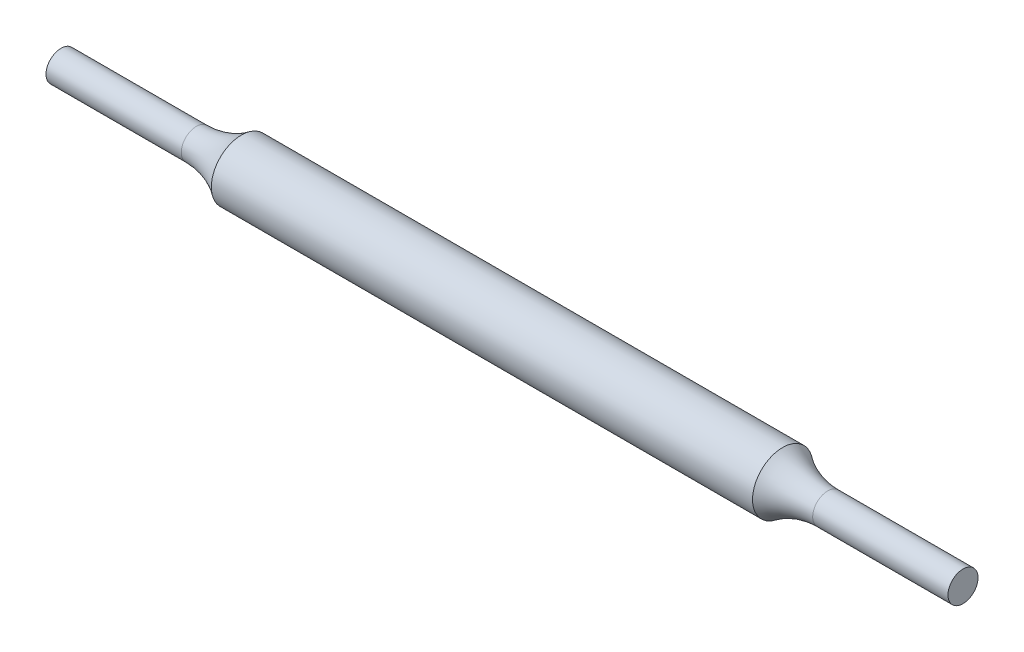
ISO-10303-21;
HEADER;
FILE_DESCRIPTION(('STEP AP214'),'2;1');
FILE_NAME('part.step','',(''),(''),'','','');
FILE_SCHEMA(('AUTOMOTIVE_DESIGN { 1 0 10303 214 1 1 1 1 }'));
ENDSEC;
DATA;
#1=APPLICATION_CONTEXT('core data for automotive mechanical design processes');
#2=APPLICATION_PROTOCOL_DEFINITION('international standard','automotive_design',2000,#1);
#3=PRODUCT_CONTEXT('',#1,'mechanical');
#4=PRODUCT('Part','Part','',(#3));
#5=PRODUCT_RELATED_PRODUCT_CATEGORY('part','',(#4));
#6=PRODUCT_DEFINITION_FORMATION('','',#4);
#7=PRODUCT_DEFINITION_CONTEXT('part definition',#1,'design');
#8=PRODUCT_DEFINITION('design','',#6,#7);
#9=PRODUCT_DEFINITION_SHAPE('','',#8);
#10=(LENGTH_UNIT() NAMED_UNIT(*) SI_UNIT(.MILLI.,.METRE.));
#11=(NAMED_UNIT(*) PLANE_ANGLE_UNIT() SI_UNIT($,.RADIAN.));
#12=(NAMED_UNIT(*) SI_UNIT($,.STERADIAN.) SOLID_ANGLE_UNIT());
#13=UNCERTAINTY_MEASURE_WITH_UNIT(LENGTH_MEASURE(1.E-05),#10,'distance_accuracy_value','');
#14=(GEOMETRIC_REPRESENTATION_CONTEXT(3) GLOBAL_UNCERTAINTY_ASSIGNED_CONTEXT((#13)) GLOBAL_UNIT_ASSIGNED_CONTEXT((#10,
#11,#12)) REPRESENTATION_CONTEXT('',''));
#15=CARTESIAN_POINT('',(0.,0.,0.));
#16=DIRECTION('',(0.,0.,1.));
#17=DIRECTION('',(1.,0.,0.));
#18=AXIS2_PLACEMENT_3D('',#15,#16,#17);
#19=CARTESIAN_POINT('',(0.,0.,0.));
#20=DIRECTION('',(1.,0.,0.));
#21=DIRECTION('',(0.,0.,-1.));
#22=AXIS2_PLACEMENT_3D('',#19,#20,#21);
#23=PLANE('',#22);
#24=CARTESIAN_POINT('',(0.,0.,0.));
#25=DIRECTION('',(-1.,0.,0.));
#26=DIRECTION('',(0.,0.,1.));
#27=AXIS2_PLACEMENT_3D('',#24,#25,#26);
#28=CIRCLE('',#27,1.);
#29=CARTESIAN_POINT('',(0.,0.,1.));
#30=VERTEX_POINT('',#29);
#31=EDGE_CURVE('E57',#30,#30,#28,.T.);
#32=ORIENTED_EDGE('',*,*,#31,.T.);
#33=EDGE_LOOP('',(#32));
#34=FACE_BOUND('',#33,.T.);
#35=ADVANCED_FACE('F35',(#34),#23,.F.);
#36=CARTESIAN_POINT('',(60.,0.,0.));
#37=DIRECTION('',(-1.,0.,0.));
#38=DIRECTION('',(0.,0.,1.));
#39=AXIS2_PLACEMENT_3D('',#36,#37,#38);
#40=PLANE('',#39);
#41=CARTESIAN_POINT('',(60.,0.,0.));
#42=DIRECTION('',(-1.,0.,0.));
#43=DIRECTION('',(0.,0.,1.));
#44=AXIS2_PLACEMENT_3D('',#41,#42,#43);
#45=CIRCLE('',#44,1.);
#46=CARTESIAN_POINT('',(60.,0.,1.));
#47=VERTEX_POINT('',#46);
#48=EDGE_CURVE('E10',#47,#47,#45,.T.);
#49=ORIENTED_EDGE('',*,*,#48,.F.);
#50=EDGE_LOOP('',(#49));
#51=FACE_BOUND('',#50,.T.);
#52=ADVANCED_FACE('F87',(#51),#40,.F.);
#53=CARTESIAN_POINT('',(0.,0.,0.));
#54=DIRECTION('',(-1.,0.,0.));
#55=DIRECTION('',(0.,0.,1.));
#56=AXIS2_PLACEMENT_3D('',#53,#54,#55);
#57=CYLINDRICAL_SURFACE('',#56,1.);
#58=CARTESIAN_POINT('',(51.,0.,0.));
#59=DIRECTION('',(-1.,0.,0.));
#60=DIRECTION('',(0.,0.,1.));
#61=AXIS2_PLACEMENT_3D('',#58,#59,#60);
#62=CIRCLE('',#61,0.999999999999999);
#63=CARTESIAN_POINT('',(51.,0.,0.999999999999999));
#64=VERTEX_POINT('',#63);
#65=EDGE_CURVE('E41',#64,#64,#62,.T.);
#66=ORIENTED_EDGE('',*,*,#65,.F.);
#67=EDGE_LOOP('',(#66));
#68=FACE_BOUND('',#67,.T.);
#69=ORIENTED_EDGE('',*,*,#48,.T.);
#70=EDGE_LOOP('',(#69));
#71=FACE_BOUND('',#70,.T.);
#72=ADVANCED_FACE('F82',(#68,#71),#57,.T.);
#73=CARTESIAN_POINT('',(51.,0.,0.));
#74=DIRECTION('',(-1.,0.,0.));
#75=DIRECTION('',(0.,0.,1.));
#76=AXIS2_PLACEMENT_3D('',#73,#74,#75);
#77=TOROIDAL_SURFACE('',#76,6.00000000000002,5.00000000000002);
#78=CARTESIAN_POINT('',(48.,0.,0.));
#79=DIRECTION('',(-1.,0.,0.));
#80=DIRECTION('',(0.,0.,1.));
#81=AXIS2_PLACEMENT_3D('',#78,#79,#80);
#82=CIRCLE('',#81,2.);
#83=CARTESIAN_POINT('',(48.,0.,2.));
#84=VERTEX_POINT('',#83);
#85=EDGE_CURVE('E45',#84,#84,#82,.T.);
#86=ORIENTED_EDGE('',*,*,#85,.F.);
#87=EDGE_LOOP('',(#86));
#88=FACE_BOUND('',#87,.T.);
#89=ORIENTED_EDGE('',*,*,#65,.T.);
#90=EDGE_LOOP('',(#89));
#91=FACE_BOUND('',#90,.T.);
#92=ADVANCED_FACE('F77',(#88,#91),#77,.F.);
#93=CARTESIAN_POINT('',(0.,0.,0.));
#94=DIRECTION('',(-1.,0.,0.));
#95=DIRECTION('',(0.,0.,1.));
#96=AXIS2_PLACEMENT_3D('',#93,#94,#95);
#97=CYLINDRICAL_SURFACE('',#96,2.);
#98=CARTESIAN_POINT('',(12.,0.,0.));
#99=DIRECTION('',(-1.,0.,0.));
#100=DIRECTION('',(0.,0.,1.));
#101=AXIS2_PLACEMENT_3D('',#98,#99,#100);
#102=CIRCLE('',#101,2.);
#103=CARTESIAN_POINT('',(12.,0.,2.));
#104=VERTEX_POINT('',#103);
#105=EDGE_CURVE('E49',#104,#104,#102,.T.);
#106=ORIENTED_EDGE('',*,*,#105,.F.);
#107=EDGE_LOOP('',(#106));
#108=FACE_BOUND('',#107,.T.);
#109=ORIENTED_EDGE('',*,*,#85,.T.);
#110=EDGE_LOOP('',(#109));
#111=FACE_BOUND('',#110,.T.);
#112=ADVANCED_FACE('F71',(#108,#111),#97,.T.);
#113=CARTESIAN_POINT('',(9.,0.,0.));
#114=DIRECTION('',(-1.,0.,0.));
#115=DIRECTION('',(0.,0.,1.));
#116=AXIS2_PLACEMENT_3D('',#113,#114,#115);
#117=TOROIDAL_SURFACE('',#116,6.00000000000001,5.00000000000001);
#118=CARTESIAN_POINT('',(9.,0.,0.));
#119=DIRECTION('',(-1.,0.,0.));
#120=DIRECTION('',(0.,0.,1.));
#121=AXIS2_PLACEMENT_3D('',#118,#119,#120);
#122=CIRCLE('',#121,1.);
#123=CARTESIAN_POINT('',(9.,0.,1.));
#124=VERTEX_POINT('',#123);
#125=EDGE_CURVE('E54',#124,#124,#122,.T.);
#126=ORIENTED_EDGE('',*,*,#125,.F.);
#127=EDGE_LOOP('',(#126));
#128=FACE_BOUND('',#127,.T.);
#129=ORIENTED_EDGE('',*,*,#105,.T.);
#130=EDGE_LOOP('',(#129));
#131=FACE_BOUND('',#130,.T.);
#132=ADVANCED_FACE('F65',(#128,#131),#117,.F.);
#133=CARTESIAN_POINT('',(0.,0.,0.));
#134=DIRECTION('',(-1.,0.,0.));
#135=DIRECTION('',(0.,0.,1.));
#136=AXIS2_PLACEMENT_3D('',#133,#134,#135);
#137=CYLINDRICAL_SURFACE('',#136,1.);
#138=ORIENTED_EDGE('',*,*,#31,.F.);
#139=EDGE_LOOP('',(#138));
#140=FACE_BOUND('',#139,.T.);
#141=ORIENTED_EDGE('',*,*,#125,.T.);
#142=EDGE_LOOP('',(#141));
#143=FACE_BOUND('',#142,.T.);
#144=ADVANCED_FACE('F62',(#140,#143),#137,.T.);
#145=CLOSED_SHELL('',(#35,#52,#72,#92,#112,#132,#144));
#146=MANIFOLD_SOLID_BREP('B2',#145);
#147=ADVANCED_BREP_SHAPE_REPRESENTATION('',(#18,#146),#14);
#148=SHAPE_DEFINITION_REPRESENTATION(#9,#147);
ENDSEC;
END-ISO-10303-21;
